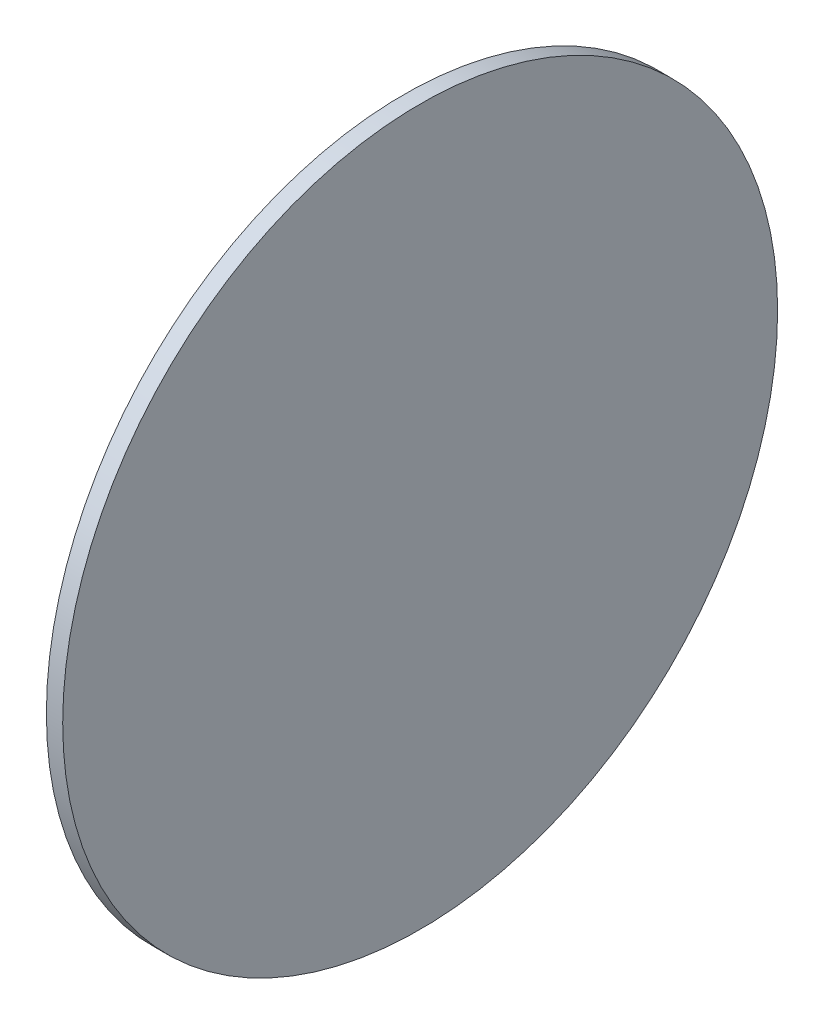
ISO-10303-21;
HEADER;
FILE_DESCRIPTION(('STEP AP214'),'2;1');
FILE_NAME('part.step','',(''),(''),'','','');
FILE_SCHEMA(('AUTOMOTIVE_DESIGN { 1 0 10303 214 1 1 1 1 }'));
ENDSEC;
DATA;
#1=APPLICATION_CONTEXT('core data for automotive mechanical design processes');
#2=APPLICATION_PROTOCOL_DEFINITION('international standard','automotive_design',2000,#1);
#3=PRODUCT_CONTEXT('',#1,'mechanical');
#4=PRODUCT('Part','Part','',(#3));
#5=PRODUCT_RELATED_PRODUCT_CATEGORY('part','',(#4));
#6=PRODUCT_DEFINITION_FORMATION('','',#4);
#7=PRODUCT_DEFINITION_CONTEXT('part definition',#1,'design');
#8=PRODUCT_DEFINITION('design','',#6,#7);
#9=PRODUCT_DEFINITION_SHAPE('','',#8);
#10=(LENGTH_UNIT() NAMED_UNIT(*) SI_UNIT(.MILLI.,.METRE.));
#11=(NAMED_UNIT(*) PLANE_ANGLE_UNIT() SI_UNIT($,.RADIAN.));
#12=(NAMED_UNIT(*) SI_UNIT($,.STERADIAN.) SOLID_ANGLE_UNIT());
#13=UNCERTAINTY_MEASURE_WITH_UNIT(LENGTH_MEASURE(1.E-05),#10,'distance_accuracy_value','');
#14=(GEOMETRIC_REPRESENTATION_CONTEXT(3) GLOBAL_UNCERTAINTY_ASSIGNED_CONTEXT((#13)) GLOBAL_UNIT_ASSIGNED_CONTEXT((#10,
#11,#12)) REPRESENTATION_CONTEXT('',''));
#15=CARTESIAN_POINT('',(0.,0.,0.));
#16=DIRECTION('',(0.,0.,1.));
#17=DIRECTION('',(1.,0.,0.));
#18=AXIS2_PLACEMENT_3D('',#15,#16,#17);
#19=CARTESIAN_POINT('',(1.15,0.,0.));
#20=DIRECTION('',(-1.,0.,0.));
#21=DIRECTION('',(0.,0.,1.));
#22=AXIS2_PLACEMENT_3D('',#19,#20,#21);
#23=CYLINDRICAL_SURFACE('',#22,25.2);
#24=CARTESIAN_POINT('',(1.15,0.,0.));
#25=DIRECTION('',(1.,0.,0.));
#26=DIRECTION('',(0.,0.,-1.));
#27=AXIS2_PLACEMENT_3D('',#24,#25,#26);
#28=CIRCLE('',#27,25.2);
#29=CARTESIAN_POINT('',(1.15,0.,-25.2));
#30=VERTEX_POINT('',#29);
#31=EDGE_CURVE('E10',#30,#30,#28,.T.);
#32=ORIENTED_EDGE('',*,*,#31,.F.);
#33=EDGE_LOOP('',(#32));
#34=FACE_BOUND('',#33,.T.);
#35=CARTESIAN_POINT('',(0.,0.,0.));
#36=DIRECTION('',(1.,0.,0.));
#37=DIRECTION('',(0.,0.,-1.));
#38=AXIS2_PLACEMENT_3D('',#35,#36,#37);
#39=CIRCLE('',#38,25.2);
#40=CARTESIAN_POINT('',(0.,0.,-25.2));
#41=VERTEX_POINT('',#40);
#42=EDGE_CURVE('E37',#41,#41,#39,.T.);
#43=ORIENTED_EDGE('',*,*,#42,.T.);
#44=EDGE_LOOP('',(#43));
#45=FACE_BOUND('',#44,.T.);
#46=ADVANCED_FACE('F40',(#34,#45),#23,.T.);
#47=CARTESIAN_POINT('',(1.15,0.,0.));
#48=DIRECTION('',(1.,0.,0.));
#49=DIRECTION('',(0.,0.,-1.));
#50=AXIS2_PLACEMENT_3D('',#47,#48,#49);
#51=PLANE('',#50);
#52=ORIENTED_EDGE('',*,*,#31,.T.);
#53=EDGE_LOOP('',(#52));
#54=FACE_BOUND('',#53,.T.);
#55=ADVANCED_FACE('F55',(#54),#51,.T.);
#56=CARTESIAN_POINT('',(0.,0.,0.));
#57=DIRECTION('',(1.,0.,0.));
#58=DIRECTION('',(0.,0.,-1.));
#59=AXIS2_PLACEMENT_3D('',#56,#57,#58);
#60=PLANE('',#59);
#61=ORIENTED_EDGE('',*,*,#42,.F.);
#62=EDGE_LOOP('',(#61));
#63=FACE_BOUND('',#62,.T.);
#64=ADVANCED_FACE('F49',(#63),#60,.F.);
#65=CLOSED_SHELL('',(#46,#55,#64));
#66=MANIFOLD_SOLID_BREP('B2',#65);
#67=ADVANCED_BREP_SHAPE_REPRESENTATION('',(#18,#66),#14);
#68=SHAPE_DEFINITION_REPRESENTATION(#9,#67);
ENDSEC;
END-ISO-10303-21;
